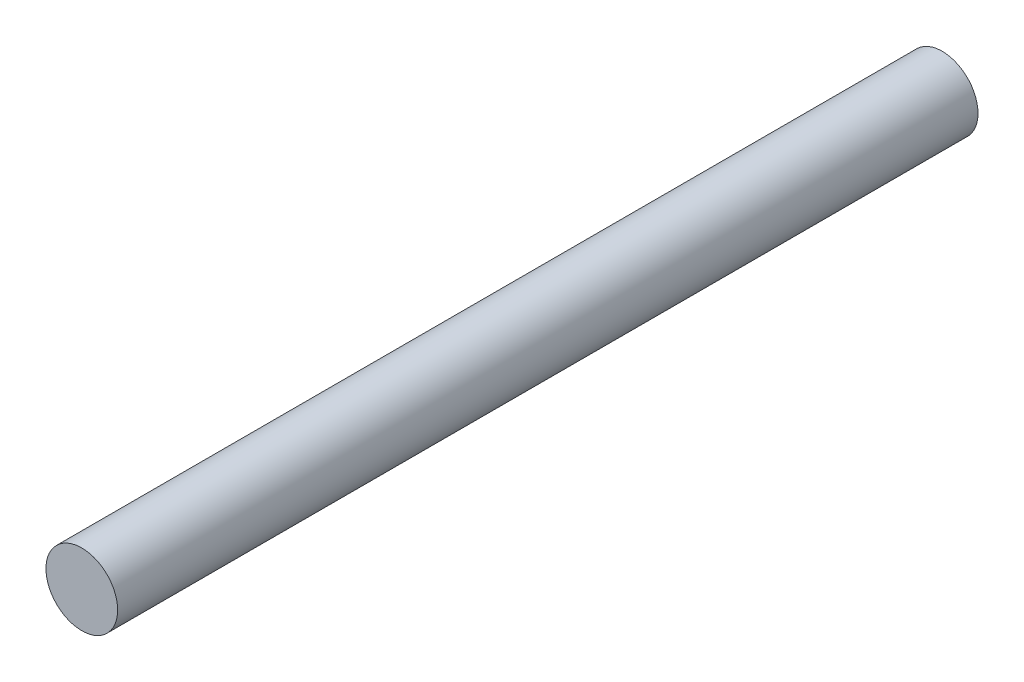
ISO-10303-21;
HEADER;
FILE_DESCRIPTION(('STEP AP214'),'2;1');
FILE_NAME('part.step','',(''),(''),'','','');
FILE_SCHEMA(('AUTOMOTIVE_DESIGN { 1 0 10303 214 1 1 1 1 }'));
ENDSEC;
DATA;
#1=APPLICATION_CONTEXT('core data for automotive mechanical design processes');
#2=APPLICATION_PROTOCOL_DEFINITION('international standard','automotive_design',2000,#1);
#3=PRODUCT_CONTEXT('',#1,'mechanical');
#4=PRODUCT('Part','Part','',(#3));
#5=PRODUCT_RELATED_PRODUCT_CATEGORY('part','',(#4));
#6=PRODUCT_DEFINITION_FORMATION('','',#4);
#7=PRODUCT_DEFINITION_CONTEXT('part definition',#1,'design');
#8=PRODUCT_DEFINITION('design','',#6,#7);
#9=PRODUCT_DEFINITION_SHAPE('','',#8);
#10=(LENGTH_UNIT() NAMED_UNIT(*) SI_UNIT(.MILLI.,.METRE.));
#11=(NAMED_UNIT(*) PLANE_ANGLE_UNIT() SI_UNIT($,.RADIAN.));
#12=(NAMED_UNIT(*) SI_UNIT($,.STERADIAN.) SOLID_ANGLE_UNIT());
#13=UNCERTAINTY_MEASURE_WITH_UNIT(LENGTH_MEASURE(1.E-05),#10,'distance_accuracy_value','');
#14=(GEOMETRIC_REPRESENTATION_CONTEXT(3) GLOBAL_UNCERTAINTY_ASSIGNED_CONTEXT((#13)) GLOBAL_UNIT_ASSIGNED_CONTEXT((#10,
#11,#12)) REPRESENTATION_CONTEXT('',''));
#15=CARTESIAN_POINT('',(0.,0.,0.));
#16=DIRECTION('',(0.,0.,1.));
#17=DIRECTION('',(1.,0.,0.));
#18=AXIS2_PLACEMENT_3D('',#15,#16,#17);
#19=CARTESIAN_POINT('',(0.,0.,60.));
#20=DIRECTION('',(0.,0.,-1.));
#21=DIRECTION('',(-1.,0.,0.));
#22=AXIS2_PLACEMENT_3D('',#19,#20,#21);
#23=CYLINDRICAL_SURFACE('',#22,2.5);
#24=CARTESIAN_POINT('',(0.,0.,60.));
#25=DIRECTION('',(0.,0.,1.));
#26=DIRECTION('',(1.,0.,0.));
#27=AXIS2_PLACEMENT_3D('',#24,#25,#26);
#28=CIRCLE('',#27,2.5);
#29=CARTESIAN_POINT('',(2.5,0.,60.));
#30=VERTEX_POINT('',#29);
#31=EDGE_CURVE('E10',#30,#30,#28,.T.);
#32=ORIENTED_EDGE('',*,*,#31,.F.);
#33=EDGE_LOOP('',(#32));
#34=FACE_BOUND('',#33,.T.);
#35=CARTESIAN_POINT('',(0.,0.,0.));
#36=DIRECTION('',(0.,0.,1.));
#37=DIRECTION('',(1.,0.,0.));
#38=AXIS2_PLACEMENT_3D('',#35,#36,#37);
#39=CIRCLE('',#38,2.5);
#40=CARTESIAN_POINT('',(2.5,0.,0.));
#41=VERTEX_POINT('',#40);
#42=EDGE_CURVE('E40',#41,#41,#39,.T.);
#43=ORIENTED_EDGE('',*,*,#42,.T.);
#44=EDGE_LOOP('',(#43));
#45=FACE_BOUND('',#44,.T.);
#46=ADVANCED_FACE('F37',(#34,#45),#23,.T.);
#47=CARTESIAN_POINT('',(0.,0.,60.));
#48=DIRECTION('',(0.,0.,1.));
#49=DIRECTION('',(1.,0.,0.));
#50=AXIS2_PLACEMENT_3D('',#47,#48,#49);
#51=PLANE('',#50);
#52=ORIENTED_EDGE('',*,*,#31,.T.);
#53=EDGE_LOOP('',(#52));
#54=FACE_BOUND('',#53,.T.);
#55=ADVANCED_FACE('F54',(#54),#51,.T.);
#56=CARTESIAN_POINT('',(0.,0.,0.));
#57=DIRECTION('',(0.,0.,1.));
#58=DIRECTION('',(1.,0.,0.));
#59=AXIS2_PLACEMENT_3D('',#56,#57,#58);
#60=PLANE('',#59);
#61=ORIENTED_EDGE('',*,*,#42,.F.);
#62=EDGE_LOOP('',(#61));
#63=FACE_BOUND('',#62,.T.);
#64=ADVANCED_FACE('F52',(#63),#60,.F.);
#65=CLOSED_SHELL('',(#46,#55,#64));
#66=MANIFOLD_SOLID_BREP('B2',#65);
#67=ADVANCED_BREP_SHAPE_REPRESENTATION('',(#18,#66),#14);
#68=SHAPE_DEFINITION_REPRESENTATION(#9,#67);
ENDSEC;
END-ISO-10303-21;
